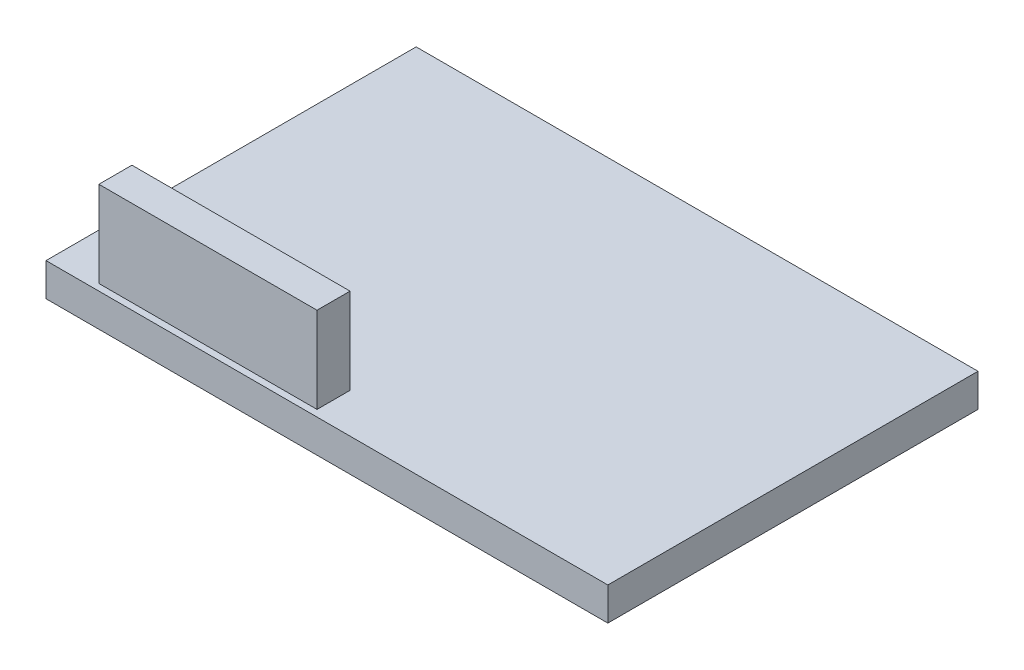
ISO-10303-21;
HEADER;
FILE_DESCRIPTION(('STEP AP214'),'2;1');
FILE_NAME('part.step','',(''),(''),'','','');
FILE_SCHEMA(('AUTOMOTIVE_DESIGN { 1 0 10303 214 1 1 1 1 }'));
ENDSEC;
DATA;
#1=APPLICATION_CONTEXT('core data for automotive mechanical design processes');
#2=APPLICATION_PROTOCOL_DEFINITION('international standard','automotive_design',2000,#1);
#3=PRODUCT_CONTEXT('',#1,'mechanical');
#4=PRODUCT('Part','Part','',(#3));
#5=PRODUCT_RELATED_PRODUCT_CATEGORY('part','',(#4));
#6=PRODUCT_DEFINITION_FORMATION('','',#4);
#7=PRODUCT_DEFINITION_CONTEXT('part definition',#1,'design');
#8=PRODUCT_DEFINITION('design','',#6,#7);
#9=PRODUCT_DEFINITION_SHAPE('','',#8);
#10=(LENGTH_UNIT() NAMED_UNIT(*) SI_UNIT(.MILLI.,.METRE.));
#11=(NAMED_UNIT(*) PLANE_ANGLE_UNIT() SI_UNIT($,.RADIAN.));
#12=(NAMED_UNIT(*) SI_UNIT($,.STERADIAN.) SOLID_ANGLE_UNIT());
#13=UNCERTAINTY_MEASURE_WITH_UNIT(LENGTH_MEASURE(1.E-05),#10,'distance_accuracy_value','');
#14=(GEOMETRIC_REPRESENTATION_CONTEXT(3) GLOBAL_UNCERTAINTY_ASSIGNED_CONTEXT((#13)) GLOBAL_UNIT_ASSIGNED_CONTEXT((#10,
#11,#12)) REPRESENTATION_CONTEXT('',''));
#15=CARTESIAN_POINT('',(0.,0.,0.));
#16=DIRECTION('',(0.,0.,1.));
#17=DIRECTION('',(1.,0.,0.));
#18=AXIS2_PLACEMENT_3D('',#15,#16,#17);
#19=CARTESIAN_POINT('',(0.,5.,0.));
#20=DIRECTION('',(0.,-1.,0.));
#21=DIRECTION('',(0.,0.,-1.));
#22=AXIS2_PLACEMENT_3D('',#19,#20,#21);
#23=PLANE('',#22);
#24=DIRECTION('',(0.,0.,1.));
#25=VECTOR('',#24,1.);
#26=CARTESIAN_POINT('',(0.,5.,0.));
#27=LINE('',#26,#25);
#28=CARTESIAN_POINT('',(0.,5.,-56.));
#29=VERTEX_POINT('',#28);
#30=CARTESIAN_POINT('',(0.,5.,0.));
#31=VERTEX_POINT('',#30);
#32=EDGE_CURVE('E278',#29,#31,#27,.T.);
#33=ORIENTED_EDGE('',*,*,#32,.T.);
#34=DIRECTION('',(1.,0.,0.));
#35=VECTOR('',#34,1.);
#36=CARTESIAN_POINT('',(0.,5.,0.));
#37=LINE('',#36,#35);
#38=CARTESIAN_POINT('',(85.,5.,0.));
#39=VERTEX_POINT('',#38);
#40=EDGE_CURVE('E281',#31,#39,#37,.T.);
#41=ORIENTED_EDGE('',*,*,#40,.T.);
#42=DIRECTION('',(0.,0.,-1.));
#43=VECTOR('',#42,1.);
#44=CARTESIAN_POINT('',(85.,5.,0.));
#45=LINE('',#44,#43);
#46=CARTESIAN_POINT('',(85.,5.,-56.));
#47=VERTEX_POINT('',#46);
#48=EDGE_CURVE('E284',#39,#47,#45,.T.);
#49=ORIENTED_EDGE('',*,*,#48,.T.);
#50=DIRECTION('',(-1.,0.,0.));
#51=VECTOR('',#50,1.);
#52=CARTESIAN_POINT('',(0.,5.,-56.));
#53=LINE('',#52,#51);
#54=EDGE_CURVE('E286',#47,#29,#53,.T.);
#55=ORIENTED_EDGE('',*,*,#54,.T.);
#56=EDGE_LOOP('',(#33,#41,#49,#55));
#57=FACE_BOUND('',#56,.T.);
#58=DIRECTION('',(0.,0.,1.));
#59=VECTOR('',#58,1.);
#60=CARTESIAN_POINT('',(7.,5.,-1.));
#61=LINE('',#60,#59);
#62=CARTESIAN_POINT('',(7.,5.,-6.));
#63=VERTEX_POINT('',#62);
#64=CARTESIAN_POINT('',(7.,5.,-1.));
#65=VERTEX_POINT('',#64);
#66=EDGE_CURVE('E239',#63,#65,#61,.T.);
#67=ORIENTED_EDGE('',*,*,#66,.F.);
#68=DIRECTION('',(-1.,0.,0.));
#69=VECTOR('',#68,1.);
#70=CARTESIAN_POINT('',(7.,5.,-6.));
#71=LINE('',#70,#69);
#72=CARTESIAN_POINT('',(40.,5.,-6.));
#73=VERTEX_POINT('',#72);
#74=EDGE_CURVE('E249',#73,#63,#71,.T.);
#75=ORIENTED_EDGE('',*,*,#74,.F.);
#76=DIRECTION('',(0.,0.,-1.));
#77=VECTOR('',#76,1.);
#78=CARTESIAN_POINT('',(40.,5.,-1.));
#79=LINE('',#78,#77);
#80=CARTESIAN_POINT('',(40.,5.,-1.));
#81=VERTEX_POINT('',#80);
#82=EDGE_CURVE('E261',#81,#73,#79,.T.);
#83=ORIENTED_EDGE('',*,*,#82,.F.);
#84=DIRECTION('',(1.,0.,0.));
#85=VECTOR('',#84,1.);
#86=CARTESIAN_POINT('',(7.,5.,-1.));
#87=LINE('',#86,#85);
#88=EDGE_CURVE('E258',#65,#81,#87,.T.);
#89=ORIENTED_EDGE('',*,*,#88,.F.);
#90=EDGE_LOOP('',(#67,#75,#83,#89));
#91=FACE_BOUND('',#90,.T.);
#92=ADVANCED_FACE('F60',(#57,#91),#23,.F.);
#93=CARTESIAN_POINT('',(0.,5.,0.));
#94=DIRECTION('',(1.,0.,0.));
#95=DIRECTION('',(0.,0.,-1.));
#96=AXIS2_PLACEMENT_3D('',#93,#94,#95);
#97=PLANE('',#96);
#98=DIRECTION('',(0.,0.,1.));
#99=VECTOR('',#98,1.);
#100=CARTESIAN_POINT('',(0.,0.,0.));
#101=LINE('',#100,#99);
#102=CARTESIAN_POINT('',(0.,0.,-56.));
#103=VERTEX_POINT('',#102);
#104=CARTESIAN_POINT('',(0.,0.,0.));
#105=VERTEX_POINT('',#104);
#106=EDGE_CURVE('E277',#103,#105,#101,.T.);
#107=ORIENTED_EDGE('',*,*,#106,.T.);
#108=DIRECTION('',(0.,-1.,0.));
#109=VECTOR('',#108,1.);
#110=CARTESIAN_POINT('',(0.,5.,0.));
#111=LINE('',#110,#109);
#112=EDGE_CURVE('E12',#31,#105,#111,.T.);
#113=ORIENTED_EDGE('',*,*,#112,.F.);
#114=ORIENTED_EDGE('',*,*,#32,.F.);
#115=DIRECTION('',(0.,-1.,0.));
#116=VECTOR('',#115,1.);
#117=CARTESIAN_POINT('',(0.,5.,-56.));
#118=LINE('',#117,#116);
#119=EDGE_CURVE('E288',#29,#103,#118,.T.);
#120=ORIENTED_EDGE('',*,*,#119,.T.);
#121=EDGE_LOOP('',(#107,#113,#114,#120));
#122=FACE_BOUND('',#121,.T.);
#123=ADVANCED_FACE('F62',(#122),#97,.F.);
#124=CARTESIAN_POINT('',(0.,5.,0.));
#125=DIRECTION('',(0.,0.,-1.));
#126=DIRECTION('',(-1.,0.,0.));
#127=AXIS2_PLACEMENT_3D('',#124,#125,#126);
#128=PLANE('',#127);
#129=DIRECTION('',(1.,0.,0.));
#130=VECTOR('',#129,1.);
#131=CARTESIAN_POINT('',(0.,0.,0.));
#132=LINE('',#131,#130);
#133=CARTESIAN_POINT('',(85.,0.,0.));
#134=VERTEX_POINT('',#133);
#135=EDGE_CURVE('E291',#105,#134,#132,.T.);
#136=ORIENTED_EDGE('',*,*,#135,.T.);
#137=DIRECTION('',(0.,-1.,0.));
#138=VECTOR('',#137,1.);
#139=CARTESIAN_POINT('',(85.,5.,0.));
#140=LINE('',#139,#138);
#141=EDGE_CURVE('E68',#39,#134,#140,.T.);
#142=ORIENTED_EDGE('',*,*,#141,.F.);
#143=ORIENTED_EDGE('',*,*,#40,.F.);
#144=ORIENTED_EDGE('',*,*,#112,.T.);
#145=EDGE_LOOP('',(#136,#142,#143,#144));
#146=FACE_BOUND('',#145,.T.);
#147=ADVANCED_FACE('F321',(#146),#128,.F.);
#148=CARTESIAN_POINT('',(85.,5.,0.));
#149=DIRECTION('',(-1.,0.,0.));
#150=DIRECTION('',(0.,0.,1.));
#151=AXIS2_PLACEMENT_3D('',#148,#149,#150);
#152=PLANE('',#151);
#153=DIRECTION('',(0.,0.,-1.));
#154=VECTOR('',#153,1.);
#155=CARTESIAN_POINT('',(85.,0.,0.));
#156=LINE('',#155,#154);
#157=CARTESIAN_POINT('',(85.,0.,-56.));
#158=VERTEX_POINT('',#157);
#159=EDGE_CURVE('E293',#134,#158,#156,.T.);
#160=ORIENTED_EDGE('',*,*,#159,.T.);
#161=DIRECTION('',(0.,-1.,0.));
#162=VECTOR('',#161,1.);
#163=CARTESIAN_POINT('',(85.,5.,-56.));
#164=LINE('',#163,#162);
#165=EDGE_CURVE('E298',#47,#158,#164,.T.);
#166=ORIENTED_EDGE('',*,*,#165,.F.);
#167=ORIENTED_EDGE('',*,*,#48,.F.);
#168=ORIENTED_EDGE('',*,*,#141,.T.);
#169=EDGE_LOOP('',(#160,#166,#167,#168));
#170=FACE_BOUND('',#169,.T.);
#171=ADVANCED_FACE('F305',(#170),#152,.F.);
#172=CARTESIAN_POINT('',(0.,5.,-56.));
#173=DIRECTION('',(0.,0.,1.));
#174=DIRECTION('',(1.,0.,0.));
#175=AXIS2_PLACEMENT_3D('',#172,#173,#174);
#176=PLANE('',#175);
#177=DIRECTION('',(-1.,0.,0.));
#178=VECTOR('',#177,1.);
#179=CARTESIAN_POINT('',(0.,0.,-56.));
#180=LINE('',#179,#178);
#181=EDGE_CURVE('E282',#158,#103,#180,.T.);
#182=ORIENTED_EDGE('',*,*,#181,.T.);
#183=ORIENTED_EDGE('',*,*,#119,.F.);
#184=ORIENTED_EDGE('',*,*,#54,.F.);
#185=ORIENTED_EDGE('',*,*,#165,.T.);
#186=EDGE_LOOP('',(#182,#183,#184,#185));
#187=FACE_BOUND('',#186,.T.);
#188=ADVANCED_FACE('F314',(#187),#176,.F.);
#189=CARTESIAN_POINT('',(0.,0.,0.));
#190=DIRECTION('',(0.,-1.,0.));
#191=DIRECTION('',(0.,0.,-1.));
#192=AXIS2_PLACEMENT_3D('',#189,#190,#191);
#193=PLANE('',#192);
#194=DIRECTION('',(0.,0.,1.));
#195=VECTOR('',#194,1.);
#196=CARTESIAN_POINT('',(76.5,0.,-54.));
#197=LINE('',#196,#195);
#198=CARTESIAN_POINT('',(76.5,0.,-54.5));
#199=VERTEX_POINT('',#198);
#200=CARTESIAN_POINT('',(76.5,0.,-3.5));
#201=VERTEX_POINT('',#200);
#202=EDGE_CURVE('E75',#199,#201,#197,.T.);
#203=ORIENTED_EDGE('',*,*,#202,.F.);
#204=DIRECTION('',(1.,0.,0.));
#205=VECTOR('',#204,1.);
#206=CARTESIAN_POINT('',(76.,0.,-54.5));
#207=LINE('',#206,#205);
#208=CARTESIAN_POINT('',(6.50000000000001,0.,-54.5));
#209=VERTEX_POINT('',#208);
#210=EDGE_CURVE('E218',#209,#199,#207,.T.);
#211=ORIENTED_EDGE('',*,*,#210,.F.);
#212=DIRECTION('',(0.,0.,-1.));
#213=VECTOR('',#212,1.);
#214=CARTESIAN_POINT('',(6.50000000000001,0.,-54.));
#215=LINE('',#214,#213);
#216=CARTESIAN_POINT('',(6.50000000000001,0.,-3.50000000000001));
#217=VERTEX_POINT('',#216);
#218=EDGE_CURVE('E232',#217,#209,#215,.T.);
#219=ORIENTED_EDGE('',*,*,#218,.F.);
#220=DIRECTION('',(-1.,0.,0.));
#221=VECTOR('',#220,1.);
#222=CARTESIAN_POINT('',(76.,0.,-3.5));
#223=LINE('',#222,#221);
#224=EDGE_CURVE('E229',#201,#217,#223,.T.);
#225=ORIENTED_EDGE('',*,*,#224,.F.);
#226=EDGE_LOOP('',(#203,#211,#219,#225));
#227=FACE_BOUND('',#226,.T.);
#228=ORIENTED_EDGE('',*,*,#106,.F.);
#229=ORIENTED_EDGE('',*,*,#181,.F.);
#230=ORIENTED_EDGE('',*,*,#159,.F.);
#231=ORIENTED_EDGE('',*,*,#135,.F.);
#232=EDGE_LOOP('',(#228,#229,#230,#231));
#233=FACE_BOUND('',#232,.T.);
#234=ADVANCED_FACE('F311',(#227,#233),#193,.T.);
#235=CARTESIAN_POINT('',(7.,18.,-1.));
#236=DIRECTION('',(1.,0.,0.));
#237=DIRECTION('',(0.,0.,-1.));
#238=AXIS2_PLACEMENT_3D('',#235,#236,#237);
#239=PLANE('',#238);
#240=ORIENTED_EDGE('',*,*,#66,.T.);
#241=DIRECTION('',(0.,-1.,0.));
#242=VECTOR('',#241,1.);
#243=CARTESIAN_POINT('',(7.,18.,-1.));
#244=LINE('',#243,#242);
#245=CARTESIAN_POINT('',(7.,18.,-1.));
#246=VERTEX_POINT('',#245);
#247=EDGE_CURVE('E274',#246,#65,#244,.T.);
#248=ORIENTED_EDGE('',*,*,#247,.F.);
#249=DIRECTION('',(0.,0.,1.));
#250=VECTOR('',#249,1.);
#251=CARTESIAN_POINT('',(7.,18.,-1.));
#252=LINE('',#251,#250);
#253=CARTESIAN_POINT('',(7.,18.,-6.));
#254=VERTEX_POINT('',#253);
#255=EDGE_CURVE('E245',#254,#246,#252,.T.);
#256=ORIENTED_EDGE('',*,*,#255,.F.);
#257=DIRECTION('',(0.,-1.,0.));
#258=VECTOR('',#257,1.);
#259=CARTESIAN_POINT('',(7.,18.,-6.));
#260=LINE('',#259,#258);
#261=EDGE_CURVE('E255',#254,#63,#260,.T.);
#262=ORIENTED_EDGE('',*,*,#261,.T.);
#263=EDGE_LOOP('',(#240,#248,#256,#262));
#264=FACE_BOUND('',#263,.T.);
#265=ADVANCED_FACE('F334',(#264),#239,.F.);
#266=CARTESIAN_POINT('',(7.,18.,-1.));
#267=DIRECTION('',(0.,0.,-1.));
#268=DIRECTION('',(-1.,0.,0.));
#269=AXIS2_PLACEMENT_3D('',#266,#267,#268);
#270=PLANE('',#269);
#271=ORIENTED_EDGE('',*,*,#88,.T.);
#272=DIRECTION('',(0.,-1.,0.));
#273=VECTOR('',#272,1.);
#274=CARTESIAN_POINT('',(40.,18.,-1.));
#275=LINE('',#274,#273);
#276=CARTESIAN_POINT('',(40.,18.,-1.));
#277=VERTEX_POINT('',#276);
#278=EDGE_CURVE('E271',#277,#81,#275,.T.);
#279=ORIENTED_EDGE('',*,*,#278,.F.);
#280=DIRECTION('',(1.,0.,0.));
#281=VECTOR('',#280,1.);
#282=CARTESIAN_POINT('',(7.,18.,-1.));
#283=LINE('',#282,#281);
#284=EDGE_CURVE('E248',#246,#277,#283,.T.);
#285=ORIENTED_EDGE('',*,*,#284,.F.);
#286=ORIENTED_EDGE('',*,*,#247,.T.);
#287=EDGE_LOOP('',(#271,#279,#285,#286));
#288=FACE_BOUND('',#287,.T.);
#289=ADVANCED_FACE('F356',(#288),#270,.F.);
#290=CARTESIAN_POINT('',(40.,18.,-1.));
#291=DIRECTION('',(-1.,0.,0.));
#292=DIRECTION('',(0.,0.,1.));
#293=AXIS2_PLACEMENT_3D('',#290,#291,#292);
#294=PLANE('',#293);
#295=ORIENTED_EDGE('',*,*,#82,.T.);
#296=DIRECTION('',(0.,-1.,0.));
#297=VECTOR('',#296,1.);
#298=CARTESIAN_POINT('',(40.,18.,-6.));
#299=LINE('',#298,#297);
#300=CARTESIAN_POINT('',(40.,18.,-6.));
#301=VERTEX_POINT('',#300);
#302=EDGE_CURVE('E268',#301,#73,#299,.T.);
#303=ORIENTED_EDGE('',*,*,#302,.F.);
#304=DIRECTION('',(0.,0.,-1.));
#305=VECTOR('',#304,1.);
#306=CARTESIAN_POINT('',(40.,18.,-1.));
#307=LINE('',#306,#305);
#308=EDGE_CURVE('E251',#277,#301,#307,.T.);
#309=ORIENTED_EDGE('',*,*,#308,.F.);
#310=ORIENTED_EDGE('',*,*,#278,.T.);
#311=EDGE_LOOP('',(#295,#303,#309,#310));
#312=FACE_BOUND('',#311,.T.);
#313=ADVANCED_FACE('F363',(#312),#294,.F.);
#314=CARTESIAN_POINT('',(7.,18.,-6.));
#315=DIRECTION('',(0.,0.,1.));
#316=DIRECTION('',(1.,0.,0.));
#317=AXIS2_PLACEMENT_3D('',#314,#315,#316);
#318=PLANE('',#317);
#319=ORIENTED_EDGE('',*,*,#74,.T.);
#320=ORIENTED_EDGE('',*,*,#261,.F.);
#321=DIRECTION('',(-1.,0.,0.));
#322=VECTOR('',#321,1.);
#323=CARTESIAN_POINT('',(7.,18.,-6.));
#324=LINE('',#323,#322);
#325=EDGE_CURVE('E253',#301,#254,#324,.T.);
#326=ORIENTED_EDGE('',*,*,#325,.F.);
#327=ORIENTED_EDGE('',*,*,#302,.T.);
#328=EDGE_LOOP('',(#319,#320,#326,#327));
#329=FACE_BOUND('',#328,.T.);
#330=ADVANCED_FACE('F370',(#329),#318,.F.);
#331=CARTESIAN_POINT('',(0.,18.,0.));
#332=DIRECTION('',(0.,-1.,0.));
#333=DIRECTION('',(0.,0.,-1.));
#334=AXIS2_PLACEMENT_3D('',#331,#332,#333);
#335=PLANE('',#334);
#336=ORIENTED_EDGE('',*,*,#255,.T.);
#337=ORIENTED_EDGE('',*,*,#284,.T.);
#338=ORIENTED_EDGE('',*,*,#308,.T.);
#339=ORIENTED_EDGE('',*,*,#325,.T.);
#340=EDGE_LOOP('',(#336,#337,#338,#339));
#341=FACE_BOUND('',#340,.T.);
#342=ADVANCED_FACE('F378',(#341),#335,.F.);
#343=CARTESIAN_POINT('',(76.5,1.,-54.));
#344=DIRECTION('',(1.,0.,0.));
#345=DIRECTION('',(0.,0.,-1.));
#346=AXIS2_PLACEMENT_3D('',#343,#344,#345);
#347=PLANE('',#346);
#348=ORIENTED_EDGE('',*,*,#202,.T.);
#349=DIRECTION('',(0.,-1.,0.));
#350=VECTOR('',#349,1.);
#351=CARTESIAN_POINT('',(76.5,1.,-3.5));
#352=LINE('',#351,#350);
#353=CARTESIAN_POINT('',(76.5,1.,-3.5));
#354=VERTEX_POINT('',#353);
#355=EDGE_CURVE('E227',#354,#201,#352,.T.);
#356=ORIENTED_EDGE('',*,*,#355,.F.);
#357=DIRECTION('',(0.,0.,1.));
#358=VECTOR('',#357,1.);
#359=CARTESIAN_POINT('',(76.5,1.,-54.));
#360=LINE('',#359,#358);
#361=CARTESIAN_POINT('',(76.5,1.,-54.5));
#362=VERTEX_POINT('',#361);
#363=EDGE_CURVE('E214',#362,#354,#360,.T.);
#364=ORIENTED_EDGE('',*,*,#363,.F.);
#365=DIRECTION('',(0.,-1.,0.));
#366=VECTOR('',#365,1.);
#367=CARTESIAN_POINT('',(76.5,1.,-54.5));
#368=LINE('',#367,#366);
#369=EDGE_CURVE('E237',#362,#199,#368,.T.);
#370=ORIENTED_EDGE('',*,*,#369,.T.);
#371=EDGE_LOOP('',(#348,#356,#364,#370));
#372=FACE_BOUND('',#371,.T.);
#373=ADVANCED_FACE('F386',(#372),#347,.F.);
#374=CARTESIAN_POINT('',(76.,1.,-54.5));
#375=DIRECTION('',(0.,0.,-1.));
#376=DIRECTION('',(-1.,0.,0.));
#377=AXIS2_PLACEMENT_3D('',#374,#375,#376);
#378=PLANE('',#377);
#379=ORIENTED_EDGE('',*,*,#210,.T.);
#380=ORIENTED_EDGE('',*,*,#369,.F.);
#381=DIRECTION('',(1.,0.,0.));
#382=VECTOR('',#381,1.);
#383=CARTESIAN_POINT('',(76.,1.,-54.5));
#384=LINE('',#383,#382);
#385=CARTESIAN_POINT('',(6.50000000000001,1.,-54.5));
#386=VERTEX_POINT('',#385);
#387=EDGE_CURVE('E224',#386,#362,#384,.T.);
#388=ORIENTED_EDGE('',*,*,#387,.F.);
#389=DIRECTION('',(0.,-1.,0.));
#390=VECTOR('',#389,1.);
#391=CARTESIAN_POINT('',(6.50000000000001,1.,-54.5));
#392=LINE('',#391,#390);
#393=EDGE_CURVE('E240',#386,#209,#392,.T.);
#394=ORIENTED_EDGE('',*,*,#393,.T.);
#395=EDGE_LOOP('',(#379,#380,#388,#394));
#396=FACE_BOUND('',#395,.T.);
#397=ADVANCED_FACE('F394',(#396),#378,.F.);
#398=CARTESIAN_POINT('',(6.50000000000001,1.,-54.));
#399=DIRECTION('',(-1.,0.,0.));
#400=DIRECTION('',(0.,0.,1.));
#401=AXIS2_PLACEMENT_3D('',#398,#399,#400);
#402=PLANE('',#401);
#403=ORIENTED_EDGE('',*,*,#218,.T.);
#404=ORIENTED_EDGE('',*,*,#393,.F.);
#405=DIRECTION('',(0.,0.,-1.));
#406=VECTOR('',#405,1.);
#407=CARTESIAN_POINT('',(6.50000000000001,1.,-54.));
#408=LINE('',#407,#406);
#409=CARTESIAN_POINT('',(6.50000000000001,1.,-3.50000000000001));
#410=VERTEX_POINT('',#409);
#411=EDGE_CURVE('E221',#410,#386,#408,.T.);
#412=ORIENTED_EDGE('',*,*,#411,.F.);
#413=DIRECTION('',(0.,-1.,0.));
#414=VECTOR('',#413,1.);
#415=CARTESIAN_POINT('',(6.50000000000001,1.,-3.50000000000001));
#416=LINE('',#415,#414);
#417=EDGE_CURVE('E242',#410,#217,#416,.T.);
#418=ORIENTED_EDGE('',*,*,#417,.T.);
#419=EDGE_LOOP('',(#403,#404,#412,#418));
#420=FACE_BOUND('',#419,.T.);
#421=ADVANCED_FACE('F401',(#420),#402,.F.);
#422=CARTESIAN_POINT('',(76.,1.,-3.5));
#423=DIRECTION('',(0.,0.,1.));
#424=DIRECTION('',(1.,0.,0.));
#425=AXIS2_PLACEMENT_3D('',#422,#423,#424);
#426=PLANE('',#425);
#427=ORIENTED_EDGE('',*,*,#224,.T.);
#428=ORIENTED_EDGE('',*,*,#417,.F.);
#429=DIRECTION('',(-1.,0.,0.));
#430=VECTOR('',#429,1.);
#431=CARTESIAN_POINT('',(76.,1.,-3.5));
#432=LINE('',#431,#430);
#433=EDGE_CURVE('E217',#354,#410,#432,.T.);
#434=ORIENTED_EDGE('',*,*,#433,.F.);
#435=ORIENTED_EDGE('',*,*,#355,.T.);
#436=EDGE_LOOP('',(#427,#428,#434,#435));
#437=FACE_BOUND('',#436,.T.);
#438=ADVANCED_FACE('F409',(#437),#426,.F.);
#439=CARTESIAN_POINT('',(0.,1.,0.));
#440=DIRECTION('',(0.,-1.,0.));
#441=DIRECTION('',(0.,0.,-1.));
#442=AXIS2_PLACEMENT_3D('',#439,#440,#441);
#443=PLANE('',#442);
#444=DIRECTION('',(1.,0.,0.));
#445=VECTOR('',#444,1.);
#446=CARTESIAN_POINT('',(76.,1.,-53.5));
#447=LINE('',#446,#445);
#448=CARTESIAN_POINT('',(7.50000000000001,1.,-53.5));
#449=VERTEX_POINT('',#448);
#450=CARTESIAN_POINT('',(75.5,1.,-53.5));
#451=VERTEX_POINT('',#450);
#452=EDGE_CURVE('E185',#449,#451,#447,.T.);
#453=ORIENTED_EDGE('',*,*,#452,.F.);
#454=DIRECTION('',(0.,0.,-1.));
#455=VECTOR('',#454,1.);
#456=CARTESIAN_POINT('',(7.50000000000001,1.,-54.));
#457=LINE('',#456,#455);
#458=CARTESIAN_POINT('',(7.50000000000001,1.,-4.50000000000001));
#459=VERTEX_POINT('',#458);
#460=EDGE_CURVE('E195',#459,#449,#457,.T.);
#461=ORIENTED_EDGE('',*,*,#460,.F.);
#462=DIRECTION('',(-1.,0.,0.));
#463=VECTOR('',#462,1.);
#464=CARTESIAN_POINT('',(76.,1.,-4.5));
#465=LINE('',#464,#463);
#466=CARTESIAN_POINT('',(75.5,1.,-4.5));
#467=VERTEX_POINT('',#466);
#468=EDGE_CURVE('E177',#467,#459,#465,.T.);
#469=ORIENTED_EDGE('',*,*,#468,.F.);
#470=DIRECTION('',(0.,0.,1.));
#471=VECTOR('',#470,1.);
#472=CARTESIAN_POINT('',(75.5,1.,-54.));
#473=LINE('',#472,#471);
#474=EDGE_CURVE('E192',#451,#467,#473,.T.);
#475=ORIENTED_EDGE('',*,*,#474,.F.);
#476=EDGE_LOOP('',(#453,#461,#469,#475));
#477=FACE_BOUND('',#476,.T.);
#478=ORIENTED_EDGE('',*,*,#363,.T.);
#479=ORIENTED_EDGE('',*,*,#433,.T.);
#480=ORIENTED_EDGE('',*,*,#411,.T.);
#481=ORIENTED_EDGE('',*,*,#387,.T.);
#482=EDGE_LOOP('',(#478,#479,#480,#481));
#483=FACE_BOUND('',#482,.T.);
#484=ADVANCED_FACE('F190',(#477,#483),#443,.T.);
#485=CARTESIAN_POINT('',(75.5,1.,-54.));
#486=DIRECTION('',(1.,0.,0.));
#487=DIRECTION('',(0.,0.,-1.));
#488=AXIS2_PLACEMENT_3D('',#485,#486,#487);
#489=PLANE('',#488);
#490=DIRECTION('',(0.,0.,1.));
#491=VECTOR('',#490,1.);
#492=CARTESIAN_POINT('',(75.5,0.,-54.));
#493=LINE('',#492,#491);
#494=CARTESIAN_POINT('',(75.5,0.,-53.5));
#495=VERTEX_POINT('',#494);
#496=CARTESIAN_POINT('',(75.5,0.,-4.5));
#497=VERTEX_POINT('',#496);
#498=EDGE_CURVE('E206',#495,#497,#493,.T.);
#499=ORIENTED_EDGE('',*,*,#498,.F.);
#500=DIRECTION('',(0.,-1.,0.));
#501=VECTOR('',#500,1.);
#502=CARTESIAN_POINT('',(75.5,1.,-53.5));
#503=LINE('',#502,#501);
#504=EDGE_CURVE('E198',#451,#495,#503,.T.);
#505=ORIENTED_EDGE('',*,*,#504,.F.);
#506=ORIENTED_EDGE('',*,*,#474,.T.);
#507=DIRECTION('',(0.,-1.,0.));
#508=VECTOR('',#507,1.);
#509=CARTESIAN_POINT('',(75.5,1.,-4.5));
#510=LINE('',#509,#508);
#511=EDGE_CURVE('E174',#467,#497,#510,.T.);
#512=ORIENTED_EDGE('',*,*,#511,.T.);
#513=EDGE_LOOP('',(#499,#505,#506,#512));
#514=FACE_BOUND('',#513,.T.);
#515=ADVANCED_FACE('F197',(#514),#489,.T.);
#516=CARTESIAN_POINT('',(76.,1.,-53.5));
#517=DIRECTION('',(0.,0.,-1.));
#518=DIRECTION('',(-1.,0.,0.));
#519=AXIS2_PLACEMENT_3D('',#516,#517,#518);
#520=PLANE('',#519);
#521=DIRECTION('',(1.,0.,0.));
#522=VECTOR('',#521,1.);
#523=CARTESIAN_POINT('',(76.,0.,-53.5));
#524=LINE('',#523,#522);
#525=CARTESIAN_POINT('',(7.50000000000001,0.,-53.5));
#526=VERTEX_POINT('',#525);
#527=EDGE_CURVE('E199',#526,#495,#524,.T.);
#528=ORIENTED_EDGE('',*,*,#527,.F.);
#529=DIRECTION('',(0.,-1.,0.));
#530=VECTOR('',#529,1.);
#531=CARTESIAN_POINT('',(7.50000000000001,1.,-53.5));
#532=LINE('',#531,#530);
#533=EDGE_CURVE('E211',#449,#526,#532,.T.);
#534=ORIENTED_EDGE('',*,*,#533,.F.);
#535=ORIENTED_EDGE('',*,*,#452,.T.);
#536=ORIENTED_EDGE('',*,*,#504,.T.);
#537=EDGE_LOOP('',(#528,#534,#535,#536));
#538=FACE_BOUND('',#537,.T.);
#539=ADVANCED_FACE('F430',(#538),#520,.T.);
#540=CARTESIAN_POINT('',(7.50000000000001,1.,-54.));
#541=DIRECTION('',(-1.,0.,0.));
#542=DIRECTION('',(0.,0.,1.));
#543=AXIS2_PLACEMENT_3D('',#540,#541,#542);
#544=PLANE('',#543);
#545=DIRECTION('',(0.,0.,-1.));
#546=VECTOR('',#545,1.);
#547=CARTESIAN_POINT('',(7.50000000000001,0.,-54.));
#548=LINE('',#547,#546);
#549=CARTESIAN_POINT('',(7.50000000000001,0.,-4.50000000000001));
#550=VERTEX_POINT('',#549);
#551=EDGE_CURVE('E83',#550,#526,#548,.T.);
#552=ORIENTED_EDGE('',*,*,#551,.F.);
#553=DIRECTION('',(0.,-1.,0.));
#554=VECTOR('',#553,1.);
#555=CARTESIAN_POINT('',(7.50000000000001,1.,-4.50000000000001));
#556=LINE('',#555,#554);
#557=EDGE_CURVE('E184',#459,#550,#556,.T.);
#558=ORIENTED_EDGE('',*,*,#557,.F.);
#559=ORIENTED_EDGE('',*,*,#460,.T.);
#560=ORIENTED_EDGE('',*,*,#533,.T.);
#561=EDGE_LOOP('',(#552,#558,#559,#560));
#562=FACE_BOUND('',#561,.T.);
#563=ADVANCED_FACE('F437',(#562),#544,.T.);
#564=CARTESIAN_POINT('',(76.,1.,-4.5));
#565=DIRECTION('',(0.,0.,1.));
#566=DIRECTION('',(1.,0.,0.));
#567=AXIS2_PLACEMENT_3D('',#564,#565,#566);
#568=PLANE('',#567);
#569=DIRECTION('',(-1.,0.,0.));
#570=VECTOR('',#569,1.);
#571=CARTESIAN_POINT('',(76.,0.,-4.5));
#572=LINE('',#571,#570);
#573=EDGE_CURVE('E179',#497,#550,#572,.T.);
#574=ORIENTED_EDGE('',*,*,#573,.F.);
#575=ORIENTED_EDGE('',*,*,#511,.F.);
#576=ORIENTED_EDGE('',*,*,#468,.T.);
#577=ORIENTED_EDGE('',*,*,#557,.T.);
#578=EDGE_LOOP('',(#574,#575,#576,#577));
#579=FACE_BOUND('',#578,.T.);
#580=ADVANCED_FACE('F176',(#579),#568,.T.);
#581=ORIENTED_EDGE('',*,*,#527,.T.);
#582=ORIENTED_EDGE('',*,*,#498,.T.);
#583=ORIENTED_EDGE('',*,*,#573,.T.);
#584=ORIENTED_EDGE('',*,*,#551,.T.);
#585=EDGE_LOOP('',(#581,#582,#583,#584));
#586=FACE_BOUND('',#585,.T.);
#587=ADVANCED_FACE('F339',(#586),#193,.T.);
#588=CLOSED_SHELL('',(#92,#123,#147,#171,#188,#234,#265,#289,#313,#330,#342,#373,#397,#421,#438,
#484,#515,#539,#563,#580,#587));
#589=MANIFOLD_SOLID_BREP('B2',#588);
#590=ADVANCED_BREP_SHAPE_REPRESENTATION('',(#18,#589),#14);
#591=SHAPE_DEFINITION_REPRESENTATION(#9,#590);
ENDSEC;
END-ISO-10303-21;
